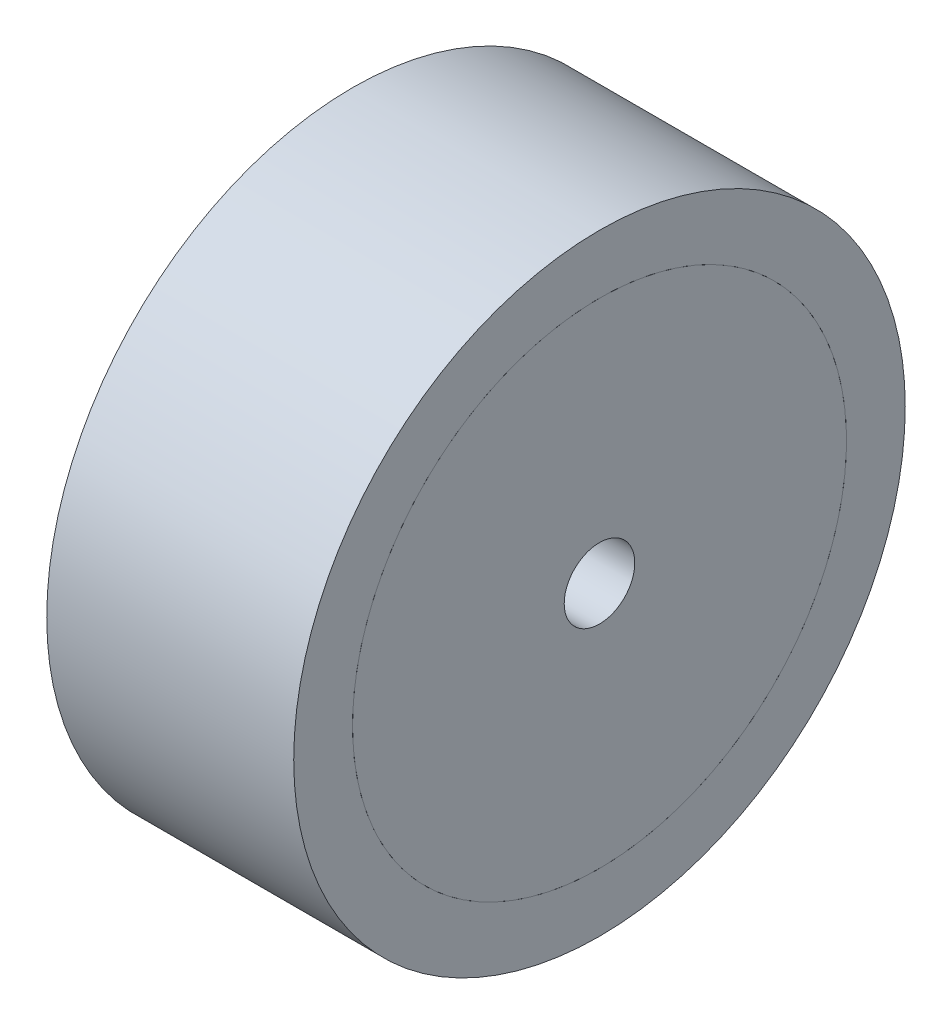
ISO-10303-21;
HEADER;
FILE_DESCRIPTION(('STEP AP214'),'2;1');
FILE_NAME('part.step','',(''),(''),'','','');
FILE_SCHEMA(('AUTOMOTIVE_DESIGN { 1 0 10303 214 1 1 1 1 }'));
ENDSEC;
DATA;
#1=APPLICATION_CONTEXT('core data for automotive mechanical design processes');
#2=APPLICATION_PROTOCOL_DEFINITION('international standard','automotive_design',2000,#1);
#3=PRODUCT_CONTEXT('',#1,'mechanical');
#4=PRODUCT('Part','Part','',(#3));
#5=PRODUCT_RELATED_PRODUCT_CATEGORY('part','',(#4));
#6=PRODUCT_DEFINITION_FORMATION('','',#4);
#7=PRODUCT_DEFINITION_CONTEXT('part definition',#1,'design');
#8=PRODUCT_DEFINITION('design','',#6,#7);
#9=PRODUCT_DEFINITION_SHAPE('','',#8);
#10=(LENGTH_UNIT() NAMED_UNIT(*) SI_UNIT(.MILLI.,.METRE.));
#11=(NAMED_UNIT(*) PLANE_ANGLE_UNIT() SI_UNIT($,.RADIAN.));
#12=(NAMED_UNIT(*) SI_UNIT($,.STERADIAN.) SOLID_ANGLE_UNIT());
#13=UNCERTAINTY_MEASURE_WITH_UNIT(LENGTH_MEASURE(1.E-05),#10,'distance_accuracy_value','');
#14=(GEOMETRIC_REPRESENTATION_CONTEXT(3) GLOBAL_UNCERTAINTY_ASSIGNED_CONTEXT((#13)) GLOBAL_UNIT_ASSIGNED_CONTEXT((#10,
#11,#12)) REPRESENTATION_CONTEXT('',''));
#15=CARTESIAN_POINT('',(0.,0.,0.));
#16=DIRECTION('',(0.,0.,1.));
#17=DIRECTION('',(1.,0.,0.));
#18=AXIS2_PLACEMENT_3D('',#15,#16,#17);
#19=CARTESIAN_POINT('',(-73.5391052434009,0.,0.));
#20=DIRECTION('',(1.,0.,0.));
#21=DIRECTION('',(0.,0.,-1.));
#22=AXIS2_PLACEMENT_3D('',#19,#20,#21);
#23=CYLINDRICAL_SURFACE('',#22,26.);
#24=CARTESIAN_POINT('',(0.,0.,0.));
#25=DIRECTION('',(1.,0.,0.));
#26=DIRECTION('',(0.,0.,-1.));
#27=AXIS2_PLACEMENT_3D('',#24,#25,#26);
#28=CIRCLE('',#27,26.);
#29=CARTESIAN_POINT('',(0.,0.,-26.));
#30=VERTEX_POINT('',#29);
#31=EDGE_CURVE('E12',#30,#30,#28,.F.);
#32=CARTESIAN_POINT('',(21.,0.,0.));
#33=DIRECTION('',(1.,0.,0.));
#34=DIRECTION('',(0.,0.,-1.));
#35=AXIS2_PLACEMENT_3D('',#32,#33,#34);
#36=CIRCLE('',#35,26.);
#37=CARTESIAN_POINT('',(21.,0.,-26.));
#38=VERTEX_POINT('',#37);
#39=EDGE_CURVE('E64',#38,#38,#36,.T.);
#40=CARTESIAN_POINT('',(0.,0.,-26.));
#41=CARTESIAN_POINT('',(0.218749999999999,0.,-26.));
#42=CARTESIAN_POINT('',(0.437499999999998,0.,-26.));
#43=CARTESIAN_POINT('',(0.874999999999996,0.,-26.));
#44=CARTESIAN_POINT('',(1.09375,0.,-26.));
#45=CARTESIAN_POINT('',(1.53125,0.,-26.));
#46=CARTESIAN_POINT('',(1.75,0.,-26.));
#47=CARTESIAN_POINT('',(2.1875,0.,-26.));
#48=CARTESIAN_POINT('',(2.40625,0.,-26.));
#49=CARTESIAN_POINT('',(2.84375,0.,-26.));
#50=CARTESIAN_POINT('',(3.0625,0.,-26.));
#51=CARTESIAN_POINT('',(3.5,0.,-26.));
#52=CARTESIAN_POINT('',(3.71875,0.,-26.));
#53=CARTESIAN_POINT('',(4.15625,0.,-26.));
#54=CARTESIAN_POINT('',(4.37499999999999,0.,-26.));
#55=CARTESIAN_POINT('',(4.8125,0.,-26.));
#56=CARTESIAN_POINT('',(5.03125,0.,-26.));
#57=CARTESIAN_POINT('',(5.46875,0.,-26.));
#58=CARTESIAN_POINT('',(5.6875,0.,-26.));
#59=CARTESIAN_POINT('',(6.125,0.,-26.));
#60=CARTESIAN_POINT('',(6.34375,0.,-26.));
#61=CARTESIAN_POINT('',(6.78125,0.,-26.));
#62=CARTESIAN_POINT('',(7.,0.,-26.));
#63=CARTESIAN_POINT('',(7.4375,0.,-26.));
#64=CARTESIAN_POINT('',(7.65624999999999,0.,-26.));
#65=CARTESIAN_POINT('',(8.09374999999999,0.,-26.));
#66=CARTESIAN_POINT('',(8.31249999999999,0.,-26.));
#67=CARTESIAN_POINT('',(8.74999999999999,0.,-26.));
#68=CARTESIAN_POINT('',(8.96875,0.,-26.));
#69=CARTESIAN_POINT('',(9.40625,0.,-26.));
#70=CARTESIAN_POINT('',(9.625,0.,-26.));
#71=CARTESIAN_POINT('',(10.0625,0.,-26.));
#72=CARTESIAN_POINT('',(10.28125,0.,-26.));
#73=CARTESIAN_POINT('',(10.71875,0.,-26.));
#74=CARTESIAN_POINT('',(10.9375,0.,-26.));
#75=CARTESIAN_POINT('',(11.375,0.,-26.));
#76=CARTESIAN_POINT('',(11.59375,0.,-26.));
#77=CARTESIAN_POINT('',(12.03125,0.,-26.));
#78=CARTESIAN_POINT('',(12.25,0.,-26.));
#79=CARTESIAN_POINT('',(12.6875,0.,-26.));
#80=CARTESIAN_POINT('',(12.90625,0.,-26.));
#81=CARTESIAN_POINT('',(13.34375,0.,-26.));
#82=CARTESIAN_POINT('',(13.5625,0.,-26.));
#83=CARTESIAN_POINT('',(14.,0.,-26.));
#84=CARTESIAN_POINT('',(14.21875,0.,-26.));
#85=CARTESIAN_POINT('',(14.65625,0.,-26.));
#86=CARTESIAN_POINT('',(14.875,0.,-26.));
#87=CARTESIAN_POINT('',(15.3125,0.,-26.));
#88=CARTESIAN_POINT('',(15.53125,0.,-26.));
#89=CARTESIAN_POINT('',(15.96875,0.,-26.));
#90=CARTESIAN_POINT('',(16.1875,0.,-26.));
#91=CARTESIAN_POINT('',(16.625,0.,-26.));
#92=CARTESIAN_POINT('',(16.84375,0.,-26.));
#93=CARTESIAN_POINT('',(17.28125,0.,-26.));
#94=CARTESIAN_POINT('',(17.5,0.,-26.));
#95=CARTESIAN_POINT('',(17.9375,0.,-26.));
#96=CARTESIAN_POINT('',(18.15625,0.,-26.));
#97=CARTESIAN_POINT('',(18.59375,0.,-26.));
#98=CARTESIAN_POINT('',(18.8125,0.,-26.));
#99=CARTESIAN_POINT('',(19.25,0.,-26.));
#100=CARTESIAN_POINT('',(19.46875,0.,-26.));
#101=CARTESIAN_POINT('',(19.90625,0.,-26.));
#102=CARTESIAN_POINT('',(20.125,0.,-26.));
#103=CARTESIAN_POINT('',(20.5625,0.,-26.));
#104=CARTESIAN_POINT('',(20.78125,0.,-26.));
#105=CARTESIAN_POINT('',(21.,0.,-26.));
#106=B_SPLINE_CURVE_WITH_KNOTS('',3,(#40,#41,#42,#43,#44,#45,#46,#47,#48,#49,#50,#51,#52,#53,
#54,#55,#56,#57,#58,#59,#60,#61,#62,#63,#64,#65,#66,#67,#68,#69,#70,#71,#72,#73,#74,#75,#76,#77,
#78,#79,#80,#81,#82,#83,#84,#85,#86,#87,#88,#89,#90,#91,#92,#93,#94,#95,#96,#97,#98,#99,#100,
#101,#102,#103,#104,#105),.UNSPECIFIED.,.F.,.F.,(4,2,2,2,2,2,2,2,2,2,2,2,2,2,2,2,2,2,2,2,2,2,2,
2,2,2,2,2,2,2,2,2,4),(0.,0.656249999999997,1.31249999999999,1.96875000000001,2.625,3.28125,
3.9375,4.59374999999999,5.25,5.90625,6.5625,7.21875,7.87499999999999,8.53124999999999,9.1875,
9.84375,10.5,11.15625,11.8125,12.46875,13.125,13.78125,14.4375,15.09375,15.75,16.40625,17.0625,
17.71875,18.375,19.03125,19.6875,20.34375,21.),.UNSPECIFIED.);
#107=EDGE_CURVE('BSEAM53',#30,#38,#106,.T.);
#108=ORIENTED_EDGE('',*,*,#31,.F.);
#109=ORIENTED_EDGE('',*,*,#39,.F.);
#110=ORIENTED_EDGE('',*,*,#107,.T.);
#111=ORIENTED_EDGE('',*,*,#107,.F.);
#112=EDGE_LOOP('',(#108,#110,#109,#111));
#113=FACE_BOUND('',#112,.T.);
#114=ADVANCED_FACE('F53',(#113),#23,.T.);
#115=CARTESIAN_POINT('',(21.,0.,0.));
#116=DIRECTION('',(1.,0.,0.));
#117=DIRECTION('',(0.,0.,-1.));
#118=AXIS2_PLACEMENT_3D('',#115,#116,#117);
#119=PLANE('',#118);
#120=CARTESIAN_POINT('',(21.,0.,0.));
#121=DIRECTION('',(1.,0.,0.));
#122=DIRECTION('',(0.,0.,-1.));
#123=AXIS2_PLACEMENT_3D('',#120,#121,#122);
#124=CIRCLE('',#123,21.);
#125=CARTESIAN_POINT('',(21.,0.,-21.));
#126=VERTEX_POINT('',#125);
#127=EDGE_CURVE('E66',#126,#126,#124,.T.);
#128=ORIENTED_EDGE('',*,*,#127,.F.);
#129=EDGE_LOOP('',(#128));
#130=FACE_BOUND('',#129,.T.);
#131=ORIENTED_EDGE('',*,*,#39,.T.);
#132=EDGE_LOOP('',(#131));
#133=FACE_BOUND('',#132,.T.);
#134=ADVANCED_FACE('F71',(#130,#133),#119,.T.);
#135=CARTESIAN_POINT('',(-73.5391052434009,0.,0.));
#136=DIRECTION('',(1.,0.,0.));
#137=DIRECTION('',(0.,0.,-1.));
#138=AXIS2_PLACEMENT_3D('',#135,#136,#137);
#139=CYLINDRICAL_SURFACE('',#138,21.);
#140=CARTESIAN_POINT('',(0.,0.,0.));
#141=DIRECTION('',(1.,0.,0.));
#142=DIRECTION('',(0.,0.,-1.));
#143=AXIS2_PLACEMENT_3D('',#140,#141,#142);
#144=CIRCLE('',#143,21.);
#145=CARTESIAN_POINT('',(0.,0.,-21.));
#146=VERTEX_POINT('',#145);
#147=EDGE_CURVE('E56',#146,#146,#144,.F.);
#148=CARTESIAN_POINT('',(0.,0.,-21.));
#149=CARTESIAN_POINT('',(0.218749999999999,0.,-21.));
#150=CARTESIAN_POINT('',(0.437499999999998,0.,-21.));
#151=CARTESIAN_POINT('',(0.874999999999996,0.,-21.));
#152=CARTESIAN_POINT('',(1.09375,0.,-21.));
#153=CARTESIAN_POINT('',(1.53125,0.,-21.));
#154=CARTESIAN_POINT('',(1.75,0.,-21.));
#155=CARTESIAN_POINT('',(2.1875,0.,-21.));
#156=CARTESIAN_POINT('',(2.40625,0.,-21.));
#157=CARTESIAN_POINT('',(2.84375,0.,-21.));
#158=CARTESIAN_POINT('',(3.0625,0.,-21.));
#159=CARTESIAN_POINT('',(3.5,0.,-21.));
#160=CARTESIAN_POINT('',(3.71875,0.,-21.));
#161=CARTESIAN_POINT('',(4.15625,0.,-21.));
#162=CARTESIAN_POINT('',(4.37499999999999,0.,-21.));
#163=CARTESIAN_POINT('',(4.8125,0.,-21.));
#164=CARTESIAN_POINT('',(5.03125,0.,-21.));
#165=CARTESIAN_POINT('',(5.46875,0.,-21.));
#166=CARTESIAN_POINT('',(5.6875,0.,-21.));
#167=CARTESIAN_POINT('',(6.125,0.,-21.));
#168=CARTESIAN_POINT('',(6.34375,0.,-21.));
#169=CARTESIAN_POINT('',(6.78125,0.,-21.));
#170=CARTESIAN_POINT('',(7.,0.,-21.));
#171=CARTESIAN_POINT('',(7.4375,0.,-21.));
#172=CARTESIAN_POINT('',(7.65624999999999,0.,-21.));
#173=CARTESIAN_POINT('',(8.09374999999999,0.,-21.));
#174=CARTESIAN_POINT('',(8.31249999999999,0.,-21.));
#175=CARTESIAN_POINT('',(8.74999999999999,0.,-21.));
#176=CARTESIAN_POINT('',(8.96875,0.,-21.));
#177=CARTESIAN_POINT('',(9.40625,0.,-21.));
#178=CARTESIAN_POINT('',(9.625,0.,-21.));
#179=CARTESIAN_POINT('',(10.0625,0.,-21.));
#180=CARTESIAN_POINT('',(10.28125,0.,-21.));
#181=CARTESIAN_POINT('',(10.71875,0.,-21.));
#182=CARTESIAN_POINT('',(10.9375,0.,-21.));
#183=CARTESIAN_POINT('',(11.375,0.,-21.));
#184=CARTESIAN_POINT('',(11.59375,0.,-21.));
#185=CARTESIAN_POINT('',(12.03125,0.,-21.));
#186=CARTESIAN_POINT('',(12.25,0.,-21.));
#187=CARTESIAN_POINT('',(12.6875,0.,-21.));
#188=CARTESIAN_POINT('',(12.90625,0.,-21.));
#189=CARTESIAN_POINT('',(13.34375,0.,-21.));
#190=CARTESIAN_POINT('',(13.5625,0.,-21.));
#191=CARTESIAN_POINT('',(14.,0.,-21.));
#192=CARTESIAN_POINT('',(14.21875,0.,-21.));
#193=CARTESIAN_POINT('',(14.65625,0.,-21.));
#194=CARTESIAN_POINT('',(14.875,0.,-21.));
#195=CARTESIAN_POINT('',(15.3125,0.,-21.));
#196=CARTESIAN_POINT('',(15.53125,0.,-21.));
#197=CARTESIAN_POINT('',(15.96875,0.,-21.));
#198=CARTESIAN_POINT('',(16.1875,0.,-21.));
#199=CARTESIAN_POINT('',(16.625,0.,-21.));
#200=CARTESIAN_POINT('',(16.84375,0.,-21.));
#201=CARTESIAN_POINT('',(17.28125,0.,-21.));
#202=CARTESIAN_POINT('',(17.5,0.,-21.));
#203=CARTESIAN_POINT('',(17.9375,0.,-21.));
#204=CARTESIAN_POINT('',(18.15625,0.,-21.));
#205=CARTESIAN_POINT('',(18.59375,0.,-21.));
#206=CARTESIAN_POINT('',(18.8125,0.,-21.));
#207=CARTESIAN_POINT('',(19.25,0.,-21.));
#208=CARTESIAN_POINT('',(19.46875,0.,-21.));
#209=CARTESIAN_POINT('',(19.90625,0.,-21.));
#210=CARTESIAN_POINT('',(20.125,0.,-21.));
#211=CARTESIAN_POINT('',(20.5625,0.,-21.));
#212=CARTESIAN_POINT('',(20.78125,0.,-21.));
#213=CARTESIAN_POINT('',(21.,0.,-21.));
#214=B_SPLINE_CURVE_WITH_KNOTS('',3,(#148,#149,#150,#151,#152,#153,#154,#155,#156,#157,#158,
#159,#160,#161,#162,#163,#164,#165,#166,#167,#168,#169,#170,#171,#172,#173,#174,#175,#176,#177,
#178,#179,#180,#181,#182,#183,#184,#185,#186,#187,#188,#189,#190,#191,#192,#193,#194,#195,#196,
#197,#198,#199,#200,#201,#202,#203,#204,#205,#206,#207,#208,#209,#210,#211,#212,#213),
.UNSPECIFIED.,.F.,.F.,(4,2,2,2,2,2,2,2,2,2,2,2,2,2,2,2,2,2,2,2,2,2,2,2,2,2,2,2,2,2,2,2,4),(0.,
0.656249999999997,1.31249999999999,1.96875000000001,2.625,3.28125,3.9375,4.59374999999999,5.25,
5.90625,6.5625,7.21875,7.87499999999999,8.53124999999999,9.1875,9.84375,10.5,11.15625,11.8125,
12.46875,13.125,13.78125,14.4375,15.09375,15.75,16.40625,17.0625,17.71875,18.375,19.03125,
19.6875,20.34375,21.),.UNSPECIFIED.);
#215=EDGE_CURVE('BSEAM78',#146,#126,#214,.T.);
#216=ORIENTED_EDGE('',*,*,#147,.T.);
#217=ORIENTED_EDGE('',*,*,#127,.T.);
#218=ORIENTED_EDGE('',*,*,#215,.T.);
#219=ORIENTED_EDGE('',*,*,#215,.F.);
#220=EDGE_LOOP('',(#216,#218,#217,#219));
#221=FACE_BOUND('',#220,.T.);
#222=ADVANCED_FACE('F78',(#221),#139,.F.);
#223=CARTESIAN_POINT('',(0.,0.,0.));
#224=DIRECTION('',(1.,0.,0.));
#225=DIRECTION('',(0.,0.,-1.));
#226=AXIS2_PLACEMENT_3D('',#223,#224,#225);
#227=PLANE('',#226);
#228=ORIENTED_EDGE('',*,*,#31,.T.);
#229=EDGE_LOOP('',(#228));
#230=FACE_BOUND('',#229,.T.);
#231=ORIENTED_EDGE('',*,*,#147,.F.);
#232=EDGE_LOOP('',(#231));
#233=FACE_BOUND('',#232,.T.);
#234=ADVANCED_FACE('F83',(#230,#233),#227,.F.);
#235=CLOSED_SHELL('',(#114,#134,#222,#234));
#236=MANIFOLD_SOLID_BREP('B2',#235);
#237=CARTESIAN_POINT('',(21.,0.,0.));
#238=DIRECTION('',(1.,0.,0.));
#239=DIRECTION('',(0.,0.,-1.));
#240=AXIS2_PLACEMENT_3D('',#237,#238,#239);
#241=PLANE('',#240);
#242=CARTESIAN_POINT('',(21.,0.,0.));
#243=DIRECTION('',(1.,0.,0.));
#244=DIRECTION('',(0.,0.,-1.));
#245=AXIS2_PLACEMENT_3D('',#242,#243,#244);
#246=CIRCLE('',#245,21.);
#247=CARTESIAN_POINT('',(21.,0.,21.));
#248=VERTEX_POINT('',#247);
#249=EDGE_CURVE('E52',#248,#248,#246,.T.);
#250=ORIENTED_EDGE('',*,*,#249,.T.);
#251=EDGE_LOOP('',(#250));
#252=FACE_BOUND('',#251,.T.);
#253=CARTESIAN_POINT('',(21.,0.,0.));
#254=DIRECTION('',(1.,0.,0.));
#255=DIRECTION('',(0.,0.,-1.));
#256=AXIS2_PLACEMENT_3D('',#253,#254,#255);
#257=CIRCLE('',#256,3.);
#258=CARTESIAN_POINT('',(21.,0.,3.));
#259=VERTEX_POINT('',#258);
#260=EDGE_CURVE('E128',#259,#259,#257,.T.);
#261=ORIENTED_EDGE('',*,*,#260,.F.);
#262=EDGE_LOOP('',(#261));
#263=FACE_BOUND('',#262,.T.);
#264=ADVANCED_FACE('F115',(#252,#263),#241,.T.);
#265=CARTESIAN_POINT('',(0.,0.,0.));
#266=DIRECTION('',(1.,0.,0.));
#267=DIRECTION('',(0.,0.,-1.));
#268=AXIS2_PLACEMENT_3D('',#265,#266,#267);
#269=PLANE('',#268);
#270=CARTESIAN_POINT('',(0.,0.,0.));
#271=DIRECTION('',(1.,0.,0.));
#272=DIRECTION('',(0.,0.,-1.));
#273=AXIS2_PLACEMENT_3D('',#270,#271,#272);
#274=CIRCLE('',#273,21.);
#275=CARTESIAN_POINT('',(0.,0.,21.));
#276=VERTEX_POINT('',#275);
#277=EDGE_CURVE('E119',#276,#276,#274,.T.);
#278=ORIENTED_EDGE('',*,*,#277,.F.);
#279=EDGE_LOOP('',(#278));
#280=FACE_BOUND('',#279,.T.);
#281=CARTESIAN_POINT('',(0.,0.,0.));
#282=DIRECTION('',(1.,0.,0.));
#283=DIRECTION('',(0.,0.,-1.));
#284=AXIS2_PLACEMENT_3D('',#281,#282,#283);
#285=CIRCLE('',#284,3.);
#286=CARTESIAN_POINT('',(0.,0.,3.));
#287=VERTEX_POINT('',#286);
#288=EDGE_CURVE('E130',#287,#287,#285,.T.);
#289=ORIENTED_EDGE('',*,*,#288,.T.);
#290=EDGE_LOOP('',(#289));
#291=FACE_BOUND('',#290,.T.);
#292=ADVANCED_FACE('F142',(#280,#291),#269,.F.);
#293=CARTESIAN_POINT('',(21.,0.,0.));
#294=DIRECTION('',(-1.,0.,0.));
#295=DIRECTION('',(0.,0.,1.));
#296=AXIS2_PLACEMENT_3D('',#293,#294,#295);
#297=CYLINDRICAL_SURFACE('',#296,21.);
#298=CARTESIAN_POINT('',(21.,0.,21.));
#299=CARTESIAN_POINT('',(20.78125,0.,21.));
#300=CARTESIAN_POINT('',(20.5625,0.,21.));
#301=CARTESIAN_POINT('',(20.125,0.,21.));
#302=CARTESIAN_POINT('',(19.90625,0.,21.));
#303=CARTESIAN_POINT('',(19.46875,0.,21.));
#304=CARTESIAN_POINT('',(19.25,0.,21.));
#305=CARTESIAN_POINT('',(18.8125,0.,21.));
#306=CARTESIAN_POINT('',(18.59375,0.,21.));
#307=CARTESIAN_POINT('',(18.15625,0.,21.));
#308=CARTESIAN_POINT('',(17.9375,0.,21.));
#309=CARTESIAN_POINT('',(17.5,0.,21.));
#310=CARTESIAN_POINT('',(17.28125,0.,21.));
#311=CARTESIAN_POINT('',(16.84375,0.,21.));
#312=CARTESIAN_POINT('',(16.625,0.,21.));
#313=CARTESIAN_POINT('',(16.1875,0.,21.));
#314=CARTESIAN_POINT('',(15.96875,0.,21.));
#315=CARTESIAN_POINT('',(15.53125,0.,21.));
#316=CARTESIAN_POINT('',(15.3125,0.,21.));
#317=CARTESIAN_POINT('',(14.875,0.,21.));
#318=CARTESIAN_POINT('',(14.65625,0.,21.));
#319=CARTESIAN_POINT('',(14.21875,0.,21.));
#320=CARTESIAN_POINT('',(14.,0.,21.));
#321=CARTESIAN_POINT('',(13.5625,0.,21.));
#322=CARTESIAN_POINT('',(13.34375,0.,21.));
#323=CARTESIAN_POINT('',(12.90625,0.,21.));
#324=CARTESIAN_POINT('',(12.6875,0.,21.));
#325=CARTESIAN_POINT('',(12.25,0.,21.));
#326=CARTESIAN_POINT('',(12.03125,0.,21.));
#327=CARTESIAN_POINT('',(11.59375,0.,21.));
#328=CARTESIAN_POINT('',(11.375,0.,21.));
#329=CARTESIAN_POINT('',(10.9375,0.,21.));
#330=CARTESIAN_POINT('',(10.71875,0.,21.));
#331=CARTESIAN_POINT('',(10.28125,0.,21.));
#332=CARTESIAN_POINT('',(10.0625,0.,21.));
#333=CARTESIAN_POINT('',(9.625,0.,21.));
#334=CARTESIAN_POINT('',(9.40625,0.,21.));
#335=CARTESIAN_POINT('',(8.96875,0.,21.));
#336=CARTESIAN_POINT('',(8.75,0.,21.));
#337=CARTESIAN_POINT('',(8.3125,0.,21.));
#338=CARTESIAN_POINT('',(8.09375,0.,21.));
#339=CARTESIAN_POINT('',(7.65625,0.,21.));
#340=CARTESIAN_POINT('',(7.4375,0.,21.));
#341=CARTESIAN_POINT('',(7.,0.,21.));
#342=CARTESIAN_POINT('',(6.78125,0.,21.));
#343=CARTESIAN_POINT('',(6.34375,0.,21.));
#344=CARTESIAN_POINT('',(6.125,0.,21.));
#345=CARTESIAN_POINT('',(5.6875,0.,21.));
#346=CARTESIAN_POINT('',(5.46875,0.,21.));
#347=CARTESIAN_POINT('',(5.03125,0.,21.));
#348=CARTESIAN_POINT('',(4.8125,0.,21.));
#349=CARTESIAN_POINT('',(4.375,0.,21.));
#350=CARTESIAN_POINT('',(4.15625,0.,21.));
#351=CARTESIAN_POINT('',(3.71875,0.,21.));
#352=CARTESIAN_POINT('',(3.5,0.,21.));
#353=CARTESIAN_POINT('',(3.0625,0.,21.));
#354=CARTESIAN_POINT('',(2.84375,0.,21.));
#355=CARTESIAN_POINT('',(2.40625,0.,21.));
#356=CARTESIAN_POINT('',(2.1875,0.,21.));
#357=CARTESIAN_POINT('',(1.75,0.,21.));
#358=CARTESIAN_POINT('',(1.53125,0.,21.));
#359=CARTESIAN_POINT('',(1.09375,0.,21.));
#360=CARTESIAN_POINT('',(0.875000000000001,0.,21.));
#361=CARTESIAN_POINT('',(0.4375,0.,21.));
#362=CARTESIAN_POINT('',(0.21875,0.,21.));
#363=CARTESIAN_POINT('',(0.,0.,21.));
#364=B_SPLINE_CURVE_WITH_KNOTS('',3,(#298,#299,#300,#301,#302,#303,#304,#305,#306,#307,#308,
#309,#310,#311,#312,#313,#314,#315,#316,#317,#318,#319,#320,#321,#322,#323,#324,#325,#326,#327,
#328,#329,#330,#331,#332,#333,#334,#335,#336,#337,#338,#339,#340,#341,#342,#343,#344,#345,#346,
#347,#348,#349,#350,#351,#352,#353,#354,#355,#356,#357,#358,#359,#360,#361,#362,#363),
.UNSPECIFIED.,.F.,.F.,(4,2,2,2,2,2,2,2,2,2,2,2,2,2,2,2,2,2,2,2,2,2,2,2,2,2,2,2,2,2,2,2,4),(0.,
0.656250000000001,1.3125,1.96875,2.625,3.28125,3.9375,4.59375,5.25,5.90625,6.5625,7.21875,7.875,
8.53125,9.1875,9.84375,10.5,11.15625,11.8125,12.46875,13.125,13.78125,14.4375,15.09375,15.75,
16.40625,17.0625,17.71875,18.375,19.03125,19.6875,20.34375,21.),.UNSPECIFIED.);
#365=EDGE_CURVE('BSEAM117',#248,#276,#364,.T.);
#366=ORIENTED_EDGE('',*,*,#249,.F.);
#367=ORIENTED_EDGE('',*,*,#277,.T.);
#368=ORIENTED_EDGE('',*,*,#365,.T.);
#369=ORIENTED_EDGE('',*,*,#365,.F.);
#370=EDGE_LOOP('',(#366,#368,#367,#369));
#371=FACE_BOUND('',#370,.T.);
#372=ADVANCED_FACE('F117',(#371),#297,.T.);
#373=CARTESIAN_POINT('',(21.,0.,0.));
#374=DIRECTION('',(-1.,0.,0.));
#375=DIRECTION('',(0.,0.,1.));
#376=AXIS2_PLACEMENT_3D('',#373,#374,#375);
#377=CYLINDRICAL_SURFACE('',#376,3.);
#378=CARTESIAN_POINT('',(21.,0.,3.));
#379=CARTESIAN_POINT('',(20.78125,0.,3.));
#380=CARTESIAN_POINT('',(20.5625,0.,3.));
#381=CARTESIAN_POINT('',(20.125,0.,3.));
#382=CARTESIAN_POINT('',(19.90625,0.,3.));
#383=CARTESIAN_POINT('',(19.46875,0.,3.));
#384=CARTESIAN_POINT('',(19.25,0.,3.));
#385=CARTESIAN_POINT('',(18.8125,0.,3.));
#386=CARTESIAN_POINT('',(18.59375,0.,3.));
#387=CARTESIAN_POINT('',(18.15625,0.,3.));
#388=CARTESIAN_POINT('',(17.9375,0.,3.));
#389=CARTESIAN_POINT('',(17.5,0.,3.));
#390=CARTESIAN_POINT('',(17.28125,0.,3.));
#391=CARTESIAN_POINT('',(16.84375,0.,3.));
#392=CARTESIAN_POINT('',(16.625,0.,3.));
#393=CARTESIAN_POINT('',(16.1875,0.,3.));
#394=CARTESIAN_POINT('',(15.96875,0.,3.));
#395=CARTESIAN_POINT('',(15.53125,0.,3.));
#396=CARTESIAN_POINT('',(15.3125,0.,3.));
#397=CARTESIAN_POINT('',(14.875,0.,3.));
#398=CARTESIAN_POINT('',(14.65625,0.,3.));
#399=CARTESIAN_POINT('',(14.21875,0.,3.));
#400=CARTESIAN_POINT('',(14.,0.,3.));
#401=CARTESIAN_POINT('',(13.5625,0.,3.));
#402=CARTESIAN_POINT('',(13.34375,0.,3.));
#403=CARTESIAN_POINT('',(12.90625,0.,3.));
#404=CARTESIAN_POINT('',(12.6875,0.,3.));
#405=CARTESIAN_POINT('',(12.25,0.,3.));
#406=CARTESIAN_POINT('',(12.03125,0.,3.));
#407=CARTESIAN_POINT('',(11.59375,0.,3.));
#408=CARTESIAN_POINT('',(11.375,0.,3.));
#409=CARTESIAN_POINT('',(10.9375,0.,3.));
#410=CARTESIAN_POINT('',(10.71875,0.,3.));
#411=CARTESIAN_POINT('',(10.28125,0.,3.));
#412=CARTESIAN_POINT('',(10.0625,0.,3.));
#413=CARTESIAN_POINT('',(9.625,0.,3.));
#414=CARTESIAN_POINT('',(9.40625,0.,3.));
#415=CARTESIAN_POINT('',(8.96875,0.,3.));
#416=CARTESIAN_POINT('',(8.75,0.,3.));
#417=CARTESIAN_POINT('',(8.3125,0.,3.));
#418=CARTESIAN_POINT('',(8.09375,0.,3.));
#419=CARTESIAN_POINT('',(7.65625,0.,3.));
#420=CARTESIAN_POINT('',(7.4375,0.,3.));
#421=CARTESIAN_POINT('',(7.,0.,3.));
#422=CARTESIAN_POINT('',(6.78125,0.,3.));
#423=CARTESIAN_POINT('',(6.34375,0.,3.));
#424=CARTESIAN_POINT('',(6.125,0.,3.));
#425=CARTESIAN_POINT('',(5.6875,0.,3.));
#426=CARTESIAN_POINT('',(5.46875,0.,3.));
#427=CARTESIAN_POINT('',(5.03125,0.,3.));
#428=CARTESIAN_POINT('',(4.8125,0.,3.));
#429=CARTESIAN_POINT('',(4.375,0.,3.));
#430=CARTESIAN_POINT('',(4.15625,0.,3.));
#431=CARTESIAN_POINT('',(3.71875,0.,3.));
#432=CARTESIAN_POINT('',(3.5,0.,3.));
#433=CARTESIAN_POINT('',(3.0625,0.,3.));
#434=CARTESIAN_POINT('',(2.84375,0.,3.));
#435=CARTESIAN_POINT('',(2.40625,0.,3.));
#436=CARTESIAN_POINT('',(2.1875,0.,3.));
#437=CARTESIAN_POINT('',(1.75,0.,3.));
#438=CARTESIAN_POINT('',(1.53125,0.,3.));
#439=CARTESIAN_POINT('',(1.09375,0.,3.));
#440=CARTESIAN_POINT('',(0.875000000000001,0.,3.));
#441=CARTESIAN_POINT('',(0.4375,0.,3.));
#442=CARTESIAN_POINT('',(0.21875,0.,3.));
#443=CARTESIAN_POINT('',(0.,0.,3.));
#444=B_SPLINE_CURVE_WITH_KNOTS('',3,(#378,#379,#380,#381,#382,#383,#384,#385,#386,#387,#388,
#389,#390,#391,#392,#393,#394,#395,#396,#397,#398,#399,#400,#401,#402,#403,#404,#405,#406,#407,
#408,#409,#410,#411,#412,#413,#414,#415,#416,#417,#418,#419,#420,#421,#422,#423,#424,#425,#426,
#427,#428,#429,#430,#431,#432,#433,#434,#435,#436,#437,#438,#439,#440,#441,#442,#443),
.UNSPECIFIED.,.F.,.F.,(4,2,2,2,2,2,2,2,2,2,2,2,2,2,2,2,2,2,2,2,2,2,2,2,2,2,2,2,2,2,2,2,4),(0.,
0.656249999999997,1.3125,1.96875,2.625,3.28125,3.9375,4.59375,5.25,5.90625,6.5625,7.21875,7.875,
8.53125,9.1875,9.84375,10.5,11.15625,11.8125,12.46875,13.125,13.78125,14.4375,15.09375,15.75,
16.40625,17.0625,17.71875,18.375,19.03125,19.6875,20.34375,21.),.UNSPECIFIED.);
#445=EDGE_CURVE('BSEAM138',#259,#287,#444,.T.);
#446=ORIENTED_EDGE('',*,*,#260,.T.);
#447=ORIENTED_EDGE('',*,*,#288,.F.);
#448=ORIENTED_EDGE('',*,*,#445,.T.);
#449=ORIENTED_EDGE('',*,*,#445,.F.);
#450=EDGE_LOOP('',(#446,#448,#447,#449));
#451=FACE_BOUND('',#450,.T.);
#452=ADVANCED_FACE('F138',(#451),#377,.F.);
#453=CLOSED_SHELL('',(#264,#292,#372,#452));
#454=MANIFOLD_SOLID_BREP('B7',#453);
#455=ADVANCED_BREP_SHAPE_REPRESENTATION('',(#18,#236,#454),#14);
#456=SHAPE_DEFINITION_REPRESENTATION(#9,#455);
ENDSEC;
END-ISO-10303-21;
